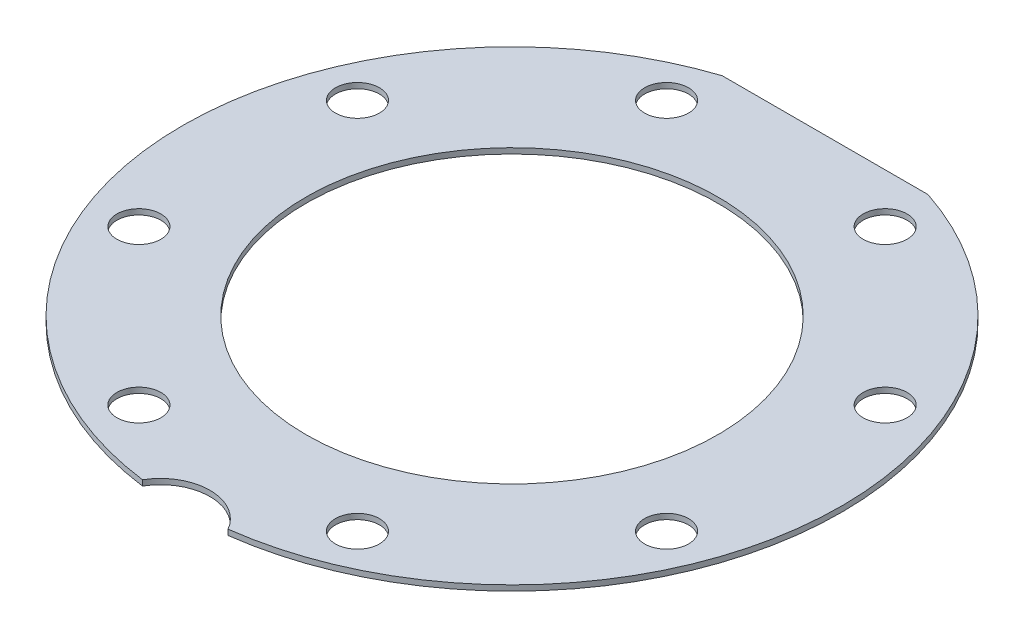
ISO-10303-21;
HEADER;
FILE_DESCRIPTION(('STEP AP214'),'2;1');
FILE_NAME('part.step','',(''),(''),'','','');
FILE_SCHEMA(('AUTOMOTIVE_DESIGN { 1 0 10303 214 1 1 1 1 }'));
ENDSEC;
DATA;
#1=APPLICATION_CONTEXT('core data for automotive mechanical design processes');
#2=APPLICATION_PROTOCOL_DEFINITION('international standard','automotive_design',2000,#1);
#3=PRODUCT_CONTEXT('',#1,'mechanical');
#4=PRODUCT('Part','Part','',(#3));
#5=PRODUCT_RELATED_PRODUCT_CATEGORY('part','',(#4));
#6=PRODUCT_DEFINITION_FORMATION('','',#4);
#7=PRODUCT_DEFINITION_CONTEXT('part definition',#1,'design');
#8=PRODUCT_DEFINITION('design','',#6,#7);
#9=PRODUCT_DEFINITION_SHAPE('','',#8);
#10=(LENGTH_UNIT() NAMED_UNIT(*) SI_UNIT(.MILLI.,.METRE.));
#11=(NAMED_UNIT(*) PLANE_ANGLE_UNIT() SI_UNIT($,.RADIAN.));
#12=(NAMED_UNIT(*) SI_UNIT($,.STERADIAN.) SOLID_ANGLE_UNIT());
#13=UNCERTAINTY_MEASURE_WITH_UNIT(LENGTH_MEASURE(1.E-05),#10,'distance_accuracy_value','');
#14=(GEOMETRIC_REPRESENTATION_CONTEXT(3) GLOBAL_UNCERTAINTY_ASSIGNED_CONTEXT((#13)) GLOBAL_UNIT_ASSIGNED_CONTEXT((#10,
#11,#12)) REPRESENTATION_CONTEXT('',''));
#15=CARTESIAN_POINT('',(0.,0.,0.));
#16=DIRECTION('',(0.,0.,1.));
#17=DIRECTION('',(1.,0.,0.));
#18=AXIS2_PLACEMENT_3D('',#15,#16,#17);
#19=CARTESIAN_POINT('',(0.,1.,64.));
#20=DIRECTION('',(0.,1.,0.));
#21=DIRECTION('',(0.,0.,1.));
#22=AXIS2_PLACEMENT_3D('',#19,#20,#21);
#23=PLANE('',#22);
#24=CARTESIAN_POINT('',(-19.8995384829828,1.,48.0417356905861));
#25=DIRECTION('',(0.,1.,0.));
#26=DIRECTION('',(0.,0.,1.));
#27=AXIS2_PLACEMENT_3D('',#24,#25,#26);
#28=CIRCLE('',#27,4.00000000000016);
#29=CARTESIAN_POINT('',(-19.8995384829828,1.,52.0417356905863));
#30=VERTEX_POINT('',#29);
#31=EDGE_CURVE('E182',#30,#30,#28,.T.);
#32=ORIENTED_EDGE('',*,*,#31,.F.);
#33=EDGE_LOOP('',(#32));
#34=FACE_BOUND('',#33,.T.);
#35=CARTESIAN_POINT('',(48.041735690588,1.,19.899538482982));
#36=DIRECTION('',(0.,1.,0.));
#37=DIRECTION('',(0.,0.,1.));
#38=AXIS2_PLACEMENT_3D('',#35,#36,#37);
#39=CIRCLE('',#38,4.00000000000212);
#40=CARTESIAN_POINT('',(48.041735690588,1.,23.8995384829841));
#41=VERTEX_POINT('',#40);
#42=EDGE_CURVE('E166',#41,#41,#39,.T.);
#43=ORIENTED_EDGE('',*,*,#42,.F.);
#44=EDGE_LOOP('',(#43));
#45=FACE_BOUND('',#44,.T.);
#46=CARTESIAN_POINT('',(19.8995384829839,1.,-48.0417356905888));
#47=DIRECTION('',(0.,1.,0.));
#48=DIRECTION('',(0.,0.,1.));
#49=AXIS2_PLACEMENT_3D('',#46,#47,#48);
#50=CIRCLE('',#49,4.0000000000022);
#51=CARTESIAN_POINT('',(19.8995384829839,1.,-44.0417356905866));
#52=VERTEX_POINT('',#51);
#53=EDGE_CURVE('E150',#52,#52,#50,.T.);
#54=ORIENTED_EDGE('',*,*,#53,.F.);
#55=EDGE_LOOP('',(#54));
#56=FACE_BOUND('',#55,.T.);
#57=CARTESIAN_POINT('',(-48.0417356905869,1.,-19.8995384829847));
#58=DIRECTION('',(0.,1.,0.));
#59=DIRECTION('',(0.,0.,1.));
#60=AXIS2_PLACEMENT_3D('',#57,#58,#59);
#61=CIRCLE('',#60,4.);
#62=CARTESIAN_POINT('',(-48.0417356905869,1.,-15.8995384829847));
#63=VERTEX_POINT('',#62);
#64=EDGE_CURVE('E134',#63,#63,#61,.T.);
#65=ORIENTED_EDGE('',*,*,#64,.F.);
#66=EDGE_LOOP('',(#65));
#67=FACE_BOUND('',#66,.T.);
#68=CARTESIAN_POINT('',(0.,1.,64.));
#69=DIRECTION('',(0.,-1.,0.));
#70=DIRECTION('',(0.,0.,1.));
#71=AXIS2_PLACEMENT_3D('',#68,#69,#70);
#72=CIRCLE('',#71,8.99999999999999);
#73=CARTESIAN_POINT('',(-7.78971286151447,1.,59.4921875));
#74=VERTEX_POINT('',#73);
#75=CARTESIAN_POINT('',(7.78971286151445,1.,59.4921875));
#76=VERTEX_POINT('',#75);
#77=EDGE_CURVE('E92',#74,#76,#72,.T.);
#78=ORIENTED_EDGE('',*,*,#77,.T.);
#79=CARTESIAN_POINT('',(0.,1.,0.));
#80=DIRECTION('',(0.,1.,0.));
#81=DIRECTION('',(0.,0.,1.));
#82=AXIS2_PLACEMENT_3D('',#79,#80,#81);
#83=CIRCLE('',#82,60.);
#84=CARTESIAN_POINT('',(18.7349939951952,1.,-57.));
#85=VERTEX_POINT('',#84);
#86=EDGE_CURVE('E87',#76,#85,#83,.T.);
#87=ORIENTED_EDGE('',*,*,#86,.T.);
#88=DIRECTION('',(-1.,0.,0.));
#89=VECTOR('',#88,1.);
#90=CARTESIAN_POINT('',(18.7349939951952,1.,-57.));
#91=LINE('',#90,#89);
#92=CARTESIAN_POINT('',(-18.7349939951952,1.,-57.));
#93=VERTEX_POINT('',#92);
#94=EDGE_CURVE('E90',#85,#93,#91,.T.);
#95=ORIENTED_EDGE('',*,*,#94,.T.);
#96=CARTESIAN_POINT('',(0.,1.,0.));
#97=DIRECTION('',(0.,1.,0.));
#98=DIRECTION('',(0.,0.,1.));
#99=AXIS2_PLACEMENT_3D('',#96,#97,#98);
#100=CIRCLE('',#99,60.);
#101=EDGE_CURVE('E57',#93,#74,#100,.T.);
#102=ORIENTED_EDGE('',*,*,#101,.T.);
#103=EDGE_LOOP('',(#78,#87,#95,#102));
#104=FACE_BOUND('',#103,.T.);
#105=CARTESIAN_POINT('',(0.,1.,0.));
#106=DIRECTION('',(0.,1.,0.));
#107=DIRECTION('',(0.,0.,1.));
#108=AXIS2_PLACEMENT_3D('',#105,#106,#107);
#109=CIRCLE('',#108,37.5);
#110=CARTESIAN_POINT('',(0.,1.,37.5));
#111=VERTEX_POINT('',#110);
#112=EDGE_CURVE('E112',#111,#111,#109,.T.);
#113=ORIENTED_EDGE('',*,*,#112,.F.);
#114=EDGE_LOOP('',(#113));
#115=FACE_BOUND('',#114,.T.);
#116=CARTESIAN_POINT('',(-19.8995384829845,1.,-48.041735690587));
#117=DIRECTION('',(0.,1.,0.));
#118=DIRECTION('',(0.,0.,1.));
#119=AXIS2_PLACEMENT_3D('',#116,#117,#118);
#120=CIRCLE('',#119,4.);
#121=CARTESIAN_POINT('',(-19.8995384829845,1.,-44.041735690587));
#122=VERTEX_POINT('',#121);
#123=EDGE_CURVE('E142',#122,#122,#120,.T.);
#124=ORIENTED_EDGE('',*,*,#123,.F.);
#125=EDGE_LOOP('',(#124));
#126=FACE_BOUND('',#125,.T.);
#127=CARTESIAN_POINT('',(48.0417356905869,1.,-19.8995384829874));
#128=DIRECTION('',(0.,1.,0.));
#129=DIRECTION('',(0.,0.,1.));
#130=AXIS2_PLACEMENT_3D('',#127,#128,#129);
#131=CIRCLE('',#130,4.00000000000258);
#132=CARTESIAN_POINT('',(48.0417356905869,1.,-15.8995384829848));
#133=VERTEX_POINT('',#132);
#134=EDGE_CURVE('E158',#133,#133,#131,.T.);
#135=ORIENTED_EDGE('',*,*,#134,.F.);
#136=EDGE_LOOP('',(#135));
#137=FACE_BOUND('',#136,.T.);
#138=CARTESIAN_POINT('',(19.8995384829866,1.,48.041735690585));
#139=DIRECTION('',(0.,1.,0.));
#140=DIRECTION('',(0.,0.,1.));
#141=AXIS2_PLACEMENT_3D('',#138,#139,#140);
#142=CIRCLE('',#141,4.00000000000109);
#143=CARTESIAN_POINT('',(19.8995384829866,1.,52.0417356905861));
#144=VERTEX_POINT('',#143);
#145=EDGE_CURVE('E174',#144,#144,#142,.T.);
#146=ORIENTED_EDGE('',*,*,#145,.F.);
#147=EDGE_LOOP('',(#146));
#148=FACE_BOUND('',#147,.T.);
#149=CARTESIAN_POINT('',(-48.0417356905872,1.,19.8995384829841));
#150=DIRECTION('',(0.,1.,0.));
#151=DIRECTION('',(0.,0.,1.));
#152=AXIS2_PLACEMENT_3D('',#149,#150,#151);
#153=CIRCLE('',#152,4.);
#154=CARTESIAN_POINT('',(-48.0417356905872,1.,23.8995384829841));
#155=VERTEX_POINT('',#154);
#156=EDGE_CURVE('E190',#155,#155,#153,.T.);
#157=ORIENTED_EDGE('',*,*,#156,.F.);
#158=EDGE_LOOP('',(#157));
#159=FACE_BOUND('',#158,.T.);
#160=ADVANCED_FACE('F39',(#34,#45,#56,#67,#104,#115,#126,#137,#148,#159),#23,.T.);
#161=CARTESIAN_POINT('',(0.,0.,64.));
#162=DIRECTION('',(0.,1.,0.));
#163=DIRECTION('',(0.,0.,1.));
#164=AXIS2_PLACEMENT_3D('',#161,#162,#163);
#165=PLANE('',#164);
#166=CARTESIAN_POINT('',(0.,0.,64.));
#167=DIRECTION('',(0.,-1.,0.));
#168=DIRECTION('',(0.,0.,1.));
#169=AXIS2_PLACEMENT_3D('',#166,#167,#168);
#170=CIRCLE('',#169,8.99999999999999);
#171=CARTESIAN_POINT('',(-7.78971286151447,0.,59.4921875));
#172=VERTEX_POINT('',#171);
#173=CARTESIAN_POINT('',(7.78971286151445,0.,59.4921875));
#174=VERTEX_POINT('',#173);
#175=EDGE_CURVE('E108',#172,#174,#170,.T.);
#176=ORIENTED_EDGE('',*,*,#175,.F.);
#177=CARTESIAN_POINT('',(0.,0.,0.));
#178=DIRECTION('',(0.,1.,0.));
#179=DIRECTION('',(0.,0.,1.));
#180=AXIS2_PLACEMENT_3D('',#177,#178,#179);
#181=CIRCLE('',#180,60.);
#182=CARTESIAN_POINT('',(-18.7349939951952,0.,-57.));
#183=VERTEX_POINT('',#182);
#184=EDGE_CURVE('E80',#183,#172,#181,.T.);
#185=ORIENTED_EDGE('',*,*,#184,.F.);
#186=DIRECTION('',(-1.,0.,0.));
#187=VECTOR('',#186,1.);
#188=CARTESIAN_POINT('',(18.7349939951952,0.,-57.));
#189=LINE('',#188,#187);
#190=CARTESIAN_POINT('',(18.7349939951952,0.,-57.));
#191=VERTEX_POINT('',#190);
#192=EDGE_CURVE('E74',#191,#183,#189,.T.);
#193=ORIENTED_EDGE('',*,*,#192,.F.);
#194=CARTESIAN_POINT('',(0.,0.,0.));
#195=DIRECTION('',(0.,1.,0.));
#196=DIRECTION('',(0.,0.,1.));
#197=AXIS2_PLACEMENT_3D('',#194,#195,#196);
#198=CIRCLE('',#197,60.);
#199=EDGE_CURVE('E97',#174,#191,#198,.T.);
#200=ORIENTED_EDGE('',*,*,#199,.F.);
#201=EDGE_LOOP('',(#176,#185,#193,#200));
#202=FACE_BOUND('',#201,.T.);
#203=CARTESIAN_POINT('',(0.,0.,0.));
#204=DIRECTION('',(0.,1.,0.));
#205=DIRECTION('',(0.,0.,1.));
#206=AXIS2_PLACEMENT_3D('',#203,#204,#205);
#207=CIRCLE('',#206,37.5);
#208=CARTESIAN_POINT('',(0.,0.,37.5));
#209=VERTEX_POINT('',#208);
#210=EDGE_CURVE('E130',#209,#209,#207,.T.);
#211=ORIENTED_EDGE('',*,*,#210,.T.);
#212=EDGE_LOOP('',(#211));
#213=FACE_BOUND('',#212,.T.);
#214=CARTESIAN_POINT('',(-48.0417356905869,0.,-19.8995384829847));
#215=DIRECTION('',(0.,1.,0.));
#216=DIRECTION('',(0.,0.,1.));
#217=AXIS2_PLACEMENT_3D('',#214,#215,#216);
#218=CIRCLE('',#217,4.);
#219=CARTESIAN_POINT('',(-48.0417356905869,0.,-15.8995384829847));
#220=VERTEX_POINT('',#219);
#221=EDGE_CURVE('E138',#220,#220,#218,.T.);
#222=ORIENTED_EDGE('',*,*,#221,.T.);
#223=EDGE_LOOP('',(#222));
#224=FACE_BOUND('',#223,.T.);
#225=CARTESIAN_POINT('',(-19.8995384829845,0.,-48.041735690587));
#226=DIRECTION('',(0.,1.,0.));
#227=DIRECTION('',(0.,0.,1.));
#228=AXIS2_PLACEMENT_3D('',#225,#226,#227);
#229=CIRCLE('',#228,4.);
#230=CARTESIAN_POINT('',(-19.8995384829845,0.,-44.041735690587));
#231=VERTEX_POINT('',#230);
#232=EDGE_CURVE('E146',#231,#231,#229,.T.);
#233=ORIENTED_EDGE('',*,*,#232,.T.);
#234=EDGE_LOOP('',(#233));
#235=FACE_BOUND('',#234,.T.);
#236=CARTESIAN_POINT('',(19.8995384829839,0.,-48.0417356905888));
#237=DIRECTION('',(0.,1.,0.));
#238=DIRECTION('',(0.,0.,1.));
#239=AXIS2_PLACEMENT_3D('',#236,#237,#238);
#240=CIRCLE('',#239,4.0000000000022);
#241=CARTESIAN_POINT('',(19.8995384829839,0.,-44.0417356905866));
#242=VERTEX_POINT('',#241);
#243=EDGE_CURVE('E154',#242,#242,#240,.T.);
#244=ORIENTED_EDGE('',*,*,#243,.T.);
#245=EDGE_LOOP('',(#244));
#246=FACE_BOUND('',#245,.T.);
#247=CARTESIAN_POINT('',(48.0417356905869,0.,-19.8995384829874));
#248=DIRECTION('',(0.,1.,0.));
#249=DIRECTION('',(0.,0.,1.));
#250=AXIS2_PLACEMENT_3D('',#247,#248,#249);
#251=CIRCLE('',#250,4.00000000000258);
#252=CARTESIAN_POINT('',(48.0417356905869,0.,-15.8995384829848));
#253=VERTEX_POINT('',#252);
#254=EDGE_CURVE('E162',#253,#253,#251,.T.);
#255=ORIENTED_EDGE('',*,*,#254,.T.);
#256=EDGE_LOOP('',(#255));
#257=FACE_BOUND('',#256,.T.);
#258=CARTESIAN_POINT('',(48.041735690588,0.,19.899538482982));
#259=DIRECTION('',(0.,1.,0.));
#260=DIRECTION('',(0.,0.,1.));
#261=AXIS2_PLACEMENT_3D('',#258,#259,#260);
#262=CIRCLE('',#261,4.00000000000212);
#263=CARTESIAN_POINT('',(48.041735690588,0.,23.8995384829841));
#264=VERTEX_POINT('',#263);
#265=EDGE_CURVE('E170',#264,#264,#262,.T.);
#266=ORIENTED_EDGE('',*,*,#265,.T.);
#267=EDGE_LOOP('',(#266));
#268=FACE_BOUND('',#267,.T.);
#269=CARTESIAN_POINT('',(19.8995384829866,0.,48.041735690585));
#270=DIRECTION('',(0.,1.,0.));
#271=DIRECTION('',(0.,0.,1.));
#272=AXIS2_PLACEMENT_3D('',#269,#270,#271);
#273=CIRCLE('',#272,4.00000000000109);
#274=CARTESIAN_POINT('',(19.8995384829866,0.,52.0417356905861));
#275=VERTEX_POINT('',#274);
#276=EDGE_CURVE('E178',#275,#275,#273,.T.);
#277=ORIENTED_EDGE('',*,*,#276,.T.);
#278=EDGE_LOOP('',(#277));
#279=FACE_BOUND('',#278,.T.);
#280=CARTESIAN_POINT('',(-19.8995384829828,0.,48.0417356905861));
#281=DIRECTION('',(0.,1.,0.));
#282=DIRECTION('',(0.,0.,1.));
#283=AXIS2_PLACEMENT_3D('',#280,#281,#282);
#284=CIRCLE('',#283,4.00000000000016);
#285=CARTESIAN_POINT('',(-19.8995384829828,0.,52.0417356905863));
#286=VERTEX_POINT('',#285);
#287=EDGE_CURVE('E186',#286,#286,#284,.T.);
#288=ORIENTED_EDGE('',*,*,#287,.T.);
#289=EDGE_LOOP('',(#288));
#290=FACE_BOUND('',#289,.T.);
#291=CARTESIAN_POINT('',(-48.0417356905872,0.,19.8995384829841));
#292=DIRECTION('',(0.,1.,0.));
#293=DIRECTION('',(0.,0.,1.));
#294=AXIS2_PLACEMENT_3D('',#291,#292,#293);
#295=CIRCLE('',#294,4.);
#296=CARTESIAN_POINT('',(-48.0417356905872,0.,23.8995384829841));
#297=VERTEX_POINT('',#296);
#298=EDGE_CURVE('E194',#297,#297,#295,.T.);
#299=ORIENTED_EDGE('',*,*,#298,.T.);
#300=EDGE_LOOP('',(#299));
#301=FACE_BOUND('',#300,.T.);
#302=ADVANCED_FACE('F125',(#202,#213,#224,#235,#246,#257,#268,#279,#290,#301),#165,.F.);
#303=CARTESIAN_POINT('',(0.,1.,64.));
#304=DIRECTION('',(0.,-1.,0.));
#305=DIRECTION('',(0.,0.,-1.));
#306=AXIS2_PLACEMENT_3D('',#303,#304,#305);
#307=CYLINDRICAL_SURFACE('',#306,8.99999999999999);
#308=ORIENTED_EDGE('',*,*,#175,.T.);
#309=DIRECTION('',(0.,-1.,0.));
#310=VECTOR('',#309,1.);
#311=CARTESIAN_POINT('',(7.78971286151445,1.,59.4921875));
#312=LINE('',#311,#310);
#313=EDGE_CURVE('E11',#76,#174,#312,.T.);
#314=ORIENTED_EDGE('',*,*,#313,.F.);
#315=ORIENTED_EDGE('',*,*,#77,.F.);
#316=DIRECTION('',(0.,-1.,0.));
#317=VECTOR('',#316,1.);
#318=CARTESIAN_POINT('',(-7.78971286151447,1.,59.4921875));
#319=LINE('',#318,#317);
#320=EDGE_CURVE('E104',#74,#172,#319,.T.);
#321=ORIENTED_EDGE('',*,*,#320,.T.);
#322=EDGE_LOOP('',(#308,#314,#315,#321));
#323=FACE_BOUND('',#322,.T.);
#324=ADVANCED_FACE('F41',(#323),#307,.F.);
#325=CARTESIAN_POINT('',(0.,1.,0.));
#326=DIRECTION('',(0.,-1.,0.));
#327=DIRECTION('',(0.,0.,-1.));
#328=AXIS2_PLACEMENT_3D('',#325,#326,#327);
#329=CYLINDRICAL_SURFACE('',#328,60.);
#330=ORIENTED_EDGE('',*,*,#199,.T.);
#331=DIRECTION('',(0.,-1.,0.));
#332=VECTOR('',#331,1.);
#333=CARTESIAN_POINT('',(18.7349939951952,1.,-57.));
#334=LINE('',#333,#332);
#335=EDGE_CURVE('E49',#85,#191,#334,.T.);
#336=ORIENTED_EDGE('',*,*,#335,.F.);
#337=ORIENTED_EDGE('',*,*,#86,.F.);
#338=ORIENTED_EDGE('',*,*,#313,.T.);
#339=EDGE_LOOP('',(#330,#336,#337,#338));
#340=FACE_BOUND('',#339,.T.);
#341=ADVANCED_FACE('F96',(#340),#329,.T.);
#342=CARTESIAN_POINT('',(18.7349939951952,1.,-57.));
#343=DIRECTION('',(0.,0.,1.));
#344=DIRECTION('',(1.,0.,0.));
#345=AXIS2_PLACEMENT_3D('',#342,#343,#344);
#346=PLANE('',#345);
#347=ORIENTED_EDGE('',*,*,#192,.T.);
#348=DIRECTION('',(0.,-1.,0.));
#349=VECTOR('',#348,1.);
#350=CARTESIAN_POINT('',(-18.7349939951952,1.,-57.));
#351=LINE('',#350,#349);
#352=EDGE_CURVE('E99',#93,#183,#351,.T.);
#353=ORIENTED_EDGE('',*,*,#352,.F.);
#354=ORIENTED_EDGE('',*,*,#94,.F.);
#355=ORIENTED_EDGE('',*,*,#335,.T.);
#356=EDGE_LOOP('',(#347,#353,#354,#355));
#357=FACE_BOUND('',#356,.T.);
#358=ADVANCED_FACE('F100',(#357),#346,.F.);
#359=CARTESIAN_POINT('',(0.,1.,0.));
#360=DIRECTION('',(0.,-1.,0.));
#361=DIRECTION('',(0.,0.,-1.));
#362=AXIS2_PLACEMENT_3D('',#359,#360,#361);
#363=CYLINDRICAL_SURFACE('',#362,60.);
#364=ORIENTED_EDGE('',*,*,#184,.T.);
#365=ORIENTED_EDGE('',*,*,#320,.F.);
#366=ORIENTED_EDGE('',*,*,#101,.F.);
#367=ORIENTED_EDGE('',*,*,#352,.T.);
#368=EDGE_LOOP('',(#364,#365,#366,#367));
#369=FACE_BOUND('',#368,.T.);
#370=ADVANCED_FACE('F122',(#369),#363,.T.);
#371=CARTESIAN_POINT('',(0.,1.,0.));
#372=DIRECTION('',(0.,-1.,0.));
#373=DIRECTION('',(0.,0.,-1.));
#374=AXIS2_PLACEMENT_3D('',#371,#372,#373);
#375=CYLINDRICAL_SURFACE('',#374,37.5);
#376=ORIENTED_EDGE('',*,*,#112,.T.);
#377=EDGE_LOOP('',(#376));
#378=FACE_BOUND('',#377,.T.);
#379=ORIENTED_EDGE('',*,*,#210,.F.);
#380=EDGE_LOOP('',(#379));
#381=FACE_BOUND('',#380,.T.);
#382=ADVANCED_FACE('F215',(#378,#381),#375,.F.);
#383=CARTESIAN_POINT('',(-48.0417356905869,1.,-19.8995384829847));
#384=DIRECTION('',(0.,-1.,0.));
#385=DIRECTION('',(0.,0.,-1.));
#386=AXIS2_PLACEMENT_3D('',#383,#384,#385);
#387=CYLINDRICAL_SURFACE('',#386,4.);
#388=ORIENTED_EDGE('',*,*,#64,.T.);
#389=EDGE_LOOP('',(#388));
#390=FACE_BOUND('',#389,.T.);
#391=ORIENTED_EDGE('',*,*,#221,.F.);
#392=EDGE_LOOP('',(#391));
#393=FACE_BOUND('',#392,.T.);
#394=ADVANCED_FACE('F261',(#390,#393),#387,.F.);
#395=CARTESIAN_POINT('',(-19.8995384829845,1.,-48.041735690587));
#396=DIRECTION('',(0.,-1.,0.));
#397=DIRECTION('',(0.,0.,-1.));
#398=AXIS2_PLACEMENT_3D('',#395,#396,#397);
#399=CYLINDRICAL_SURFACE('',#398,4.);
#400=ORIENTED_EDGE('',*,*,#123,.T.);
#401=EDGE_LOOP('',(#400));
#402=FACE_BOUND('',#401,.T.);
#403=ORIENTED_EDGE('',*,*,#232,.F.);
#404=EDGE_LOOP('',(#403));
#405=FACE_BOUND('',#404,.T.);
#406=ADVANCED_FACE('F269',(#402,#405),#399,.F.);
#407=CARTESIAN_POINT('',(19.8995384829839,1.,-48.0417356905888));
#408=DIRECTION('',(0.,-1.,0.));
#409=DIRECTION('',(0.,0.,-1.));
#410=AXIS2_PLACEMENT_3D('',#407,#408,#409);
#411=CYLINDRICAL_SURFACE('',#410,4.0000000000022);
#412=ORIENTED_EDGE('',*,*,#53,.T.);
#413=EDGE_LOOP('',(#412));
#414=FACE_BOUND('',#413,.T.);
#415=ORIENTED_EDGE('',*,*,#243,.F.);
#416=EDGE_LOOP('',(#415));
#417=FACE_BOUND('',#416,.T.);
#418=ADVANCED_FACE('F277',(#414,#417),#411,.F.);
#419=CARTESIAN_POINT('',(48.0417356905869,1.,-19.8995384829874));
#420=DIRECTION('',(0.,-1.,0.));
#421=DIRECTION('',(0.,0.,-1.));
#422=AXIS2_PLACEMENT_3D('',#419,#420,#421);
#423=CYLINDRICAL_SURFACE('',#422,4.00000000000258);
#424=ORIENTED_EDGE('',*,*,#134,.T.);
#425=EDGE_LOOP('',(#424));
#426=FACE_BOUND('',#425,.T.);
#427=ORIENTED_EDGE('',*,*,#254,.F.);
#428=EDGE_LOOP('',(#427));
#429=FACE_BOUND('',#428,.T.);
#430=ADVANCED_FACE('F286',(#426,#429),#423,.F.);
#431=CARTESIAN_POINT('',(48.041735690588,1.,19.899538482982));
#432=DIRECTION('',(0.,-1.,0.));
#433=DIRECTION('',(0.,0.,-1.));
#434=AXIS2_PLACEMENT_3D('',#431,#432,#433);
#435=CYLINDRICAL_SURFACE('',#434,4.00000000000212);
#436=ORIENTED_EDGE('',*,*,#42,.T.);
#437=EDGE_LOOP('',(#436));
#438=FACE_BOUND('',#437,.T.);
#439=ORIENTED_EDGE('',*,*,#265,.F.);
#440=EDGE_LOOP('',(#439));
#441=FACE_BOUND('',#440,.T.);
#442=ADVANCED_FACE('F295',(#438,#441),#435,.F.);
#443=CARTESIAN_POINT('',(19.8995384829866,1.,48.041735690585));
#444=DIRECTION('',(0.,-1.,0.));
#445=DIRECTION('',(0.,0.,-1.));
#446=AXIS2_PLACEMENT_3D('',#443,#444,#445);
#447=CYLINDRICAL_SURFACE('',#446,4.00000000000109);
#448=ORIENTED_EDGE('',*,*,#145,.T.);
#449=EDGE_LOOP('',(#448));
#450=FACE_BOUND('',#449,.T.);
#451=ORIENTED_EDGE('',*,*,#276,.F.);
#452=EDGE_LOOP('',(#451));
#453=FACE_BOUND('',#452,.T.);
#454=ADVANCED_FACE('F304',(#450,#453),#447,.F.);
#455=CARTESIAN_POINT('',(-19.8995384829828,1.,48.0417356905861));
#456=DIRECTION('',(0.,-1.,0.));
#457=DIRECTION('',(0.,0.,-1.));
#458=AXIS2_PLACEMENT_3D('',#455,#456,#457);
#459=CYLINDRICAL_SURFACE('',#458,4.00000000000016);
#460=ORIENTED_EDGE('',*,*,#31,.T.);
#461=EDGE_LOOP('',(#460));
#462=FACE_BOUND('',#461,.T.);
#463=ORIENTED_EDGE('',*,*,#287,.F.);
#464=EDGE_LOOP('',(#463));
#465=FACE_BOUND('',#464,.T.);
#466=ADVANCED_FACE('F313',(#462,#465),#459,.F.);
#467=CARTESIAN_POINT('',(-48.0417356905872,1.,19.8995384829841));
#468=DIRECTION('',(0.,-1.,0.));
#469=DIRECTION('',(0.,0.,-1.));
#470=AXIS2_PLACEMENT_3D('',#467,#468,#469);
#471=CYLINDRICAL_SURFACE('',#470,4.);
#472=ORIENTED_EDGE('',*,*,#156,.T.);
#473=EDGE_LOOP('',(#472));
#474=FACE_BOUND('',#473,.T.);
#475=ORIENTED_EDGE('',*,*,#298,.F.);
#476=EDGE_LOOP('',(#475));
#477=FACE_BOUND('',#476,.T.);
#478=ADVANCED_FACE('F202',(#474,#477),#471,.F.);
#479=CLOSED_SHELL('',(#160,#302,#324,#341,#358,#370,#382,#394,#406,#418,#430,#442,#454,#466,#478));
#480=MANIFOLD_SOLID_BREP('B2',#479);
#481=ADVANCED_BREP_SHAPE_REPRESENTATION('',(#18,#480),#14);
#482=SHAPE_DEFINITION_REPRESENTATION(#9,#481);
ENDSEC;
END-ISO-10303-21;
